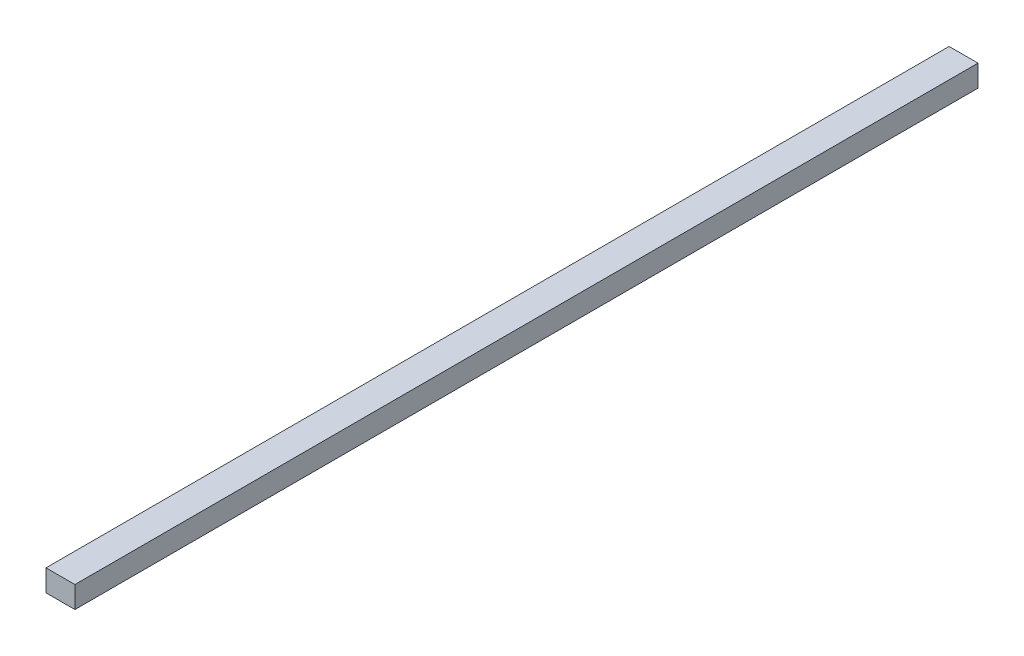
ISO-10303-21;
HEADER;
FILE_DESCRIPTION(('STEP AP214'),'2;1');
FILE_NAME('part.step','',(''),(''),'','','');
FILE_SCHEMA(('AUTOMOTIVE_DESIGN { 1 0 10303 214 1 1 1 1 }'));
ENDSEC;
DATA;
#1=APPLICATION_CONTEXT('core data for automotive mechanical design processes');
#2=APPLICATION_PROTOCOL_DEFINITION('international standard','automotive_design',2000,#1);
#3=PRODUCT_CONTEXT('',#1,'mechanical');
#4=PRODUCT('Part','Part','',(#3));
#5=PRODUCT_RELATED_PRODUCT_CATEGORY('part','',(#4));
#6=PRODUCT_DEFINITION_FORMATION('','',#4);
#7=PRODUCT_DEFINITION_CONTEXT('part definition',#1,'design');
#8=PRODUCT_DEFINITION('design','',#6,#7);
#9=PRODUCT_DEFINITION_SHAPE('','',#8);
#10=(LENGTH_UNIT() NAMED_UNIT(*) SI_UNIT(.MILLI.,.METRE.));
#11=(NAMED_UNIT(*) PLANE_ANGLE_UNIT() SI_UNIT($,.RADIAN.));
#12=(NAMED_UNIT(*) SI_UNIT($,.STERADIAN.) SOLID_ANGLE_UNIT());
#13=UNCERTAINTY_MEASURE_WITH_UNIT(LENGTH_MEASURE(1.E-05),#10,'distance_accuracy_value','');
#14=(GEOMETRIC_REPRESENTATION_CONTEXT(3) GLOBAL_UNCERTAINTY_ASSIGNED_CONTEXT((#13)) GLOBAL_UNIT_ASSIGNED_CONTEXT((#10,
#11,#12)) REPRESENTATION_CONTEXT('',''));
#15=CARTESIAN_POINT('',(0.,0.,0.));
#16=DIRECTION('',(0.,0.,1.));
#17=DIRECTION('',(1.,0.,0.));
#18=AXIS2_PLACEMENT_3D('',#15,#16,#17);
#19=CARTESIAN_POINT('',(394.,1176.,-550.));
#20=DIRECTION('',(-1.,0.,0.));
#21=DIRECTION('',(0.,0.,1.));
#22=AXIS2_PLACEMENT_3D('',#19,#20,#21);
#23=PLANE('',#22);
#24=DIRECTION('',(0.,-1.,0.));
#25=VECTOR('',#24,1.);
#26=CARTESIAN_POINT('',(394.,1176.,-50.));
#27=LINE('',#26,#25);
#28=CARTESIAN_POINT('',(394.,1188.,-50.));
#29=VERTEX_POINT('',#28);
#30=CARTESIAN_POINT('',(394.,1176.,-50.));
#31=VERTEX_POINT('',#30);
#32=EDGE_CURVE('E103',#29,#31,#27,.T.);
#33=ORIENTED_EDGE('',*,*,#32,.F.);
#34=DIRECTION('',(0.,0.,1.));
#35=VECTOR('',#34,1.);
#36=CARTESIAN_POINT('',(394.,1188.,-550.));
#37=LINE('',#36,#35);
#38=CARTESIAN_POINT('',(394.,1188.,-550.));
#39=VERTEX_POINT('',#38);
#40=EDGE_CURVE('E11',#39,#29,#37,.T.);
#41=ORIENTED_EDGE('',*,*,#40,.F.);
#42=DIRECTION('',(0.,-1.,0.));
#43=VECTOR('',#42,1.);
#44=CARTESIAN_POINT('',(394.,1176.,-550.));
#45=LINE('',#44,#43);
#46=CARTESIAN_POINT('',(394.,1176.,-550.));
#47=VERTEX_POINT('',#46);
#48=EDGE_CURVE('E97',#39,#47,#45,.T.);
#49=ORIENTED_EDGE('',*,*,#48,.T.);
#50=DIRECTION('',(0.,0.,1.));
#51=VECTOR('',#50,1.);
#52=CARTESIAN_POINT('',(394.,1176.,-550.));
#53=LINE('',#52,#51);
#54=EDGE_CURVE('E42',#47,#31,#53,.T.);
#55=ORIENTED_EDGE('',*,*,#54,.T.);
#56=EDGE_LOOP('',(#33,#41,#49,#55));
#57=FACE_BOUND('',#56,.T.);
#58=ADVANCED_FACE('F39',(#57),#23,.T.);
#59=CARTESIAN_POINT('',(394.,1188.,-550.));
#60=DIRECTION('',(0.,1.,0.));
#61=DIRECTION('',(0.,0.,1.));
#62=AXIS2_PLACEMENT_3D('',#59,#60,#61);
#63=PLANE('',#62);
#64=DIRECTION('',(-1.,0.,0.));
#65=VECTOR('',#64,1.);
#66=CARTESIAN_POINT('',(394.,1188.,-50.));
#67=LINE('',#66,#65);
#68=CARTESIAN_POINT('',(410.,1188.,-50.));
#69=VERTEX_POINT('',#68);
#70=EDGE_CURVE('E99',#69,#29,#67,.T.);
#71=ORIENTED_EDGE('',*,*,#70,.F.);
#72=DIRECTION('',(0.,0.,1.));
#73=VECTOR('',#72,1.);
#74=CARTESIAN_POINT('',(410.,1188.,-550.));
#75=LINE('',#74,#73);
#76=CARTESIAN_POINT('',(410.,1188.,-550.));
#77=VERTEX_POINT('',#76);
#78=EDGE_CURVE('E48',#77,#69,#75,.T.);
#79=ORIENTED_EDGE('',*,*,#78,.F.);
#80=DIRECTION('',(-1.,0.,0.));
#81=VECTOR('',#80,1.);
#82=CARTESIAN_POINT('',(394.,1188.,-550.));
#83=LINE('',#82,#81);
#84=EDGE_CURVE('E94',#77,#39,#83,.T.);
#85=ORIENTED_EDGE('',*,*,#84,.T.);
#86=ORIENTED_EDGE('',*,*,#40,.T.);
#87=EDGE_LOOP('',(#71,#79,#85,#86));
#88=FACE_BOUND('',#87,.T.);
#89=ADVANCED_FACE('F113',(#88),#63,.T.);
#90=CARTESIAN_POINT('',(410.,1176.,-550.));
#91=DIRECTION('',(1.,0.,0.));
#92=DIRECTION('',(0.,0.,-1.));
#93=AXIS2_PLACEMENT_3D('',#90,#91,#92);
#94=PLANE('',#93);
#95=DIRECTION('',(0.,1.,0.));
#96=VECTOR('',#95,1.);
#97=CARTESIAN_POINT('',(410.,1176.,-50.));
#98=LINE('',#97,#96);
#99=CARTESIAN_POINT('',(410.,1176.,-50.));
#100=VERTEX_POINT('',#99);
#101=EDGE_CURVE('E89',#100,#69,#98,.T.);
#102=ORIENTED_EDGE('',*,*,#101,.F.);
#103=DIRECTION('',(0.,0.,1.));
#104=VECTOR('',#103,1.);
#105=CARTESIAN_POINT('',(410.,1176.,-550.));
#106=LINE('',#105,#104);
#107=CARTESIAN_POINT('',(410.,1176.,-550.));
#108=VERTEX_POINT('',#107);
#109=EDGE_CURVE('E84',#108,#100,#106,.T.);
#110=ORIENTED_EDGE('',*,*,#109,.F.);
#111=DIRECTION('',(0.,1.,0.));
#112=VECTOR('',#111,1.);
#113=CARTESIAN_POINT('',(410.,1176.,-550.));
#114=LINE('',#113,#112);
#115=EDGE_CURVE('E87',#108,#77,#114,.T.);
#116=ORIENTED_EDGE('',*,*,#115,.T.);
#117=ORIENTED_EDGE('',*,*,#78,.T.);
#118=EDGE_LOOP('',(#102,#110,#116,#117));
#119=FACE_BOUND('',#118,.T.);
#120=ADVANCED_FACE('F86',(#119),#94,.T.);
#121=CARTESIAN_POINT('',(394.,1176.,-550.));
#122=DIRECTION('',(0.,-1.,0.));
#123=DIRECTION('',(0.,0.,-1.));
#124=AXIS2_PLACEMENT_3D('',#121,#122,#123);
#125=PLANE('',#124);
#126=DIRECTION('',(1.,0.,0.));
#127=VECTOR('',#126,1.);
#128=CARTESIAN_POINT('',(394.,1176.,-50.));
#129=LINE('',#128,#127);
#130=EDGE_CURVE('E106',#31,#100,#129,.T.);
#131=ORIENTED_EDGE('',*,*,#130,.F.);
#132=ORIENTED_EDGE('',*,*,#54,.F.);
#133=DIRECTION('',(1.,0.,0.));
#134=VECTOR('',#133,1.);
#135=CARTESIAN_POINT('',(394.,1176.,-550.));
#136=LINE('',#135,#134);
#137=EDGE_CURVE('E93',#47,#108,#136,.T.);
#138=ORIENTED_EDGE('',*,*,#137,.T.);
#139=ORIENTED_EDGE('',*,*,#109,.T.);
#140=EDGE_LOOP('',(#131,#132,#138,#139));
#141=FACE_BOUND('',#140,.T.);
#142=ADVANCED_FACE('F96',(#141),#125,.T.);
#143=CARTESIAN_POINT('',(0.,0.,-550.));
#144=DIRECTION('',(0.,0.,-1.));
#145=DIRECTION('',(-1.,0.,0.));
#146=AXIS2_PLACEMENT_3D('',#143,#144,#145);
#147=PLANE('',#146);
#148=ORIENTED_EDGE('',*,*,#48,.F.);
#149=ORIENTED_EDGE('',*,*,#84,.F.);
#150=ORIENTED_EDGE('',*,*,#115,.F.);
#151=ORIENTED_EDGE('',*,*,#137,.F.);
#152=EDGE_LOOP('',(#148,#149,#150,#151));
#153=FACE_BOUND('',#152,.T.);
#154=ADVANCED_FACE('F92',(#153),#147,.T.);
#155=CARTESIAN_POINT('',(0.,0.,-50.));
#156=DIRECTION('',(0.,0.,-1.));
#157=DIRECTION('',(-1.,0.,0.));
#158=AXIS2_PLACEMENT_3D('',#155,#156,#157);
#159=PLANE('',#158);
#160=ORIENTED_EDGE('',*,*,#32,.T.);
#161=ORIENTED_EDGE('',*,*,#130,.T.);
#162=ORIENTED_EDGE('',*,*,#101,.T.);
#163=ORIENTED_EDGE('',*,*,#70,.T.);
#164=EDGE_LOOP('',(#160,#161,#162,#163));
#165=FACE_BOUND('',#164,.T.);
#166=ADVANCED_FACE('F112',(#165),#159,.F.);
#167=CLOSED_SHELL('',(#58,#89,#120,#142,#154,#166));
#168=MANIFOLD_SOLID_BREP('B2',#167);
#169=ADVANCED_BREP_SHAPE_REPRESENTATION('',(#18,#168),#14);
#170=SHAPE_DEFINITION_REPRESENTATION(#9,#169);
ENDSEC;
END-ISO-10303-21;
